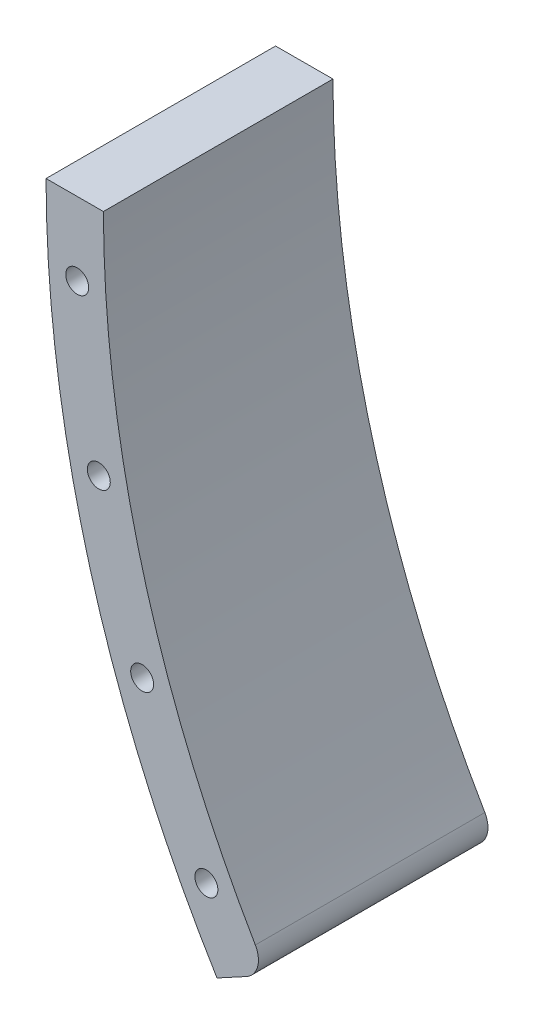
ISO-10303-21;
HEADER;
FILE_DESCRIPTION(('STEP AP214'),'2;1');
FILE_NAME('part.step','',(''),(''),'','','');
FILE_SCHEMA(('AUTOMOTIVE_DESIGN { 1 0 10303 214 1 1 1 1 }'));
ENDSEC;
DATA;
#1=APPLICATION_CONTEXT('core data for automotive mechanical design processes');
#2=APPLICATION_PROTOCOL_DEFINITION('international standard','automotive_design',2000,#1);
#3=PRODUCT_CONTEXT('',#1,'mechanical');
#4=PRODUCT('Part','Part','',(#3));
#5=PRODUCT_RELATED_PRODUCT_CATEGORY('part','',(#4));
#6=PRODUCT_DEFINITION_FORMATION('','',#4);
#7=PRODUCT_DEFINITION_CONTEXT('part definition',#1,'design');
#8=PRODUCT_DEFINITION('design','',#6,#7);
#9=PRODUCT_DEFINITION_SHAPE('','',#8);
#10=(LENGTH_UNIT() NAMED_UNIT(*) SI_UNIT(.MILLI.,.METRE.));
#11=(NAMED_UNIT(*) PLANE_ANGLE_UNIT() SI_UNIT($,.RADIAN.));
#12=(NAMED_UNIT(*) SI_UNIT($,.STERADIAN.) SOLID_ANGLE_UNIT());
#13=UNCERTAINTY_MEASURE_WITH_UNIT(LENGTH_MEASURE(1.E-05),#10,'distance_accuracy_value','');
#14=(GEOMETRIC_REPRESENTATION_CONTEXT(3) GLOBAL_UNCERTAINTY_ASSIGNED_CONTEXT((#13)) GLOBAL_UNIT_ASSIGNED_CONTEXT((#10,
#11,#12)) REPRESENTATION_CONTEXT('',''));
#15=CARTESIAN_POINT('',(0.,0.,0.));
#16=DIRECTION('',(0.,0.,1.));
#17=DIRECTION('',(1.,0.,0.));
#18=AXIS2_PLACEMENT_3D('',#15,#16,#17);
#19=CARTESIAN_POINT('',(70.,-12.3683000000003,40.));
#20=DIRECTION('',(0.,0.,1.));
#21=DIRECTION('',(1.,0.,0.));
#22=AXIS2_PLACEMENT_3D('',#19,#20,#21);
#23=PLANE('',#22);
#24=CARTESIAN_POINT('',(-117.250891281488,-79.7337489652391,40.));
#25=DIRECTION('',(0.,0.,1.));
#26=DIRECTION('',(1.,0.,0.));
#27=AXIS2_PLACEMENT_3D('',#24,#25,#26);
#28=CIRCLE('',#27,2.);
#29=CARTESIAN_POINT('',(-115.250891281488,-79.7337489652391,40.));
#30=VERTEX_POINT('',#29);
#31=EDGE_CURVE('E128',#30,#30,#28,.T.);
#32=ORIENTED_EDGE('',*,*,#31,.F.);
#33=EDGE_LOOP('',(#32));
#34=FACE_BOUND('',#33,.T.);
#35=CARTESIAN_POINT('',(-128.565543545409,-25.5107851727687,40.));
#36=DIRECTION('',(0.,0.,1.));
#37=DIRECTION('',(1.,0.,0.));
#38=AXIS2_PLACEMENT_3D('',#35,#36,#37);
#39=CIRCLE('',#38,2.);
#40=CARTESIAN_POINT('',(-126.565543545409,-25.5107851727687,40.));
#41=VERTEX_POINT('',#40);
#42=EDGE_CURVE('E116',#41,#41,#39,.T.);
#43=ORIENTED_EDGE('',*,*,#42,.F.);
#44=EDGE_LOOP('',(#43));
#45=FACE_BOUND('',#44,.T.);
#46=DIRECTION('',(0.878737629728585,0.477305120545536,0.));
#47=VECTOR('',#46,1.);
#48=CARTESIAN_POINT('',(-95.4065456337183,-113.742234823113,40.));
#49=LINE('',#48,#47);
#50=CARTESIAN_POINT('',(-104.20534041752,-118.52148822351,40.));
#51=VERTEX_POINT('',#50);
#52=CARTESIAN_POINT('',(-99.0706876937644,-115.732491878801,40.));
#53=VERTEX_POINT('',#52);
#54=EDGE_CURVE('E76',#51,#53,#49,.T.);
#55=ORIENTED_EDGE('',*,*,#54,.T.);
#56=CARTESIAN_POINT('',(-100.979908175947,-112.217541359887,40.));
#57=DIRECTION('',(0.,0.,1.));
#58=DIRECTION('',(1.,0.,0.));
#59=AXIS2_PLACEMENT_3D('',#56,#57,#58);
#60=CIRCLE('',#59,4.);
#61=CARTESIAN_POINT('',(-97.5257686168365,-110.200384968778,40.));
#62=VERTEX_POINT('',#61);
#63=EDGE_CURVE('E11',#53,#62,#60,.T.);
#64=ORIENTED_EDGE('',*,*,#63,.T.);
#65=CARTESIAN_POINT('',(70.,-12.3683000000003,40.));
#66=DIRECTION('',(0.,0.,-1.));
#67=DIRECTION('',(1.,0.,0.));
#68=AXIS2_PLACEMENT_3D('',#65,#66,#67);
#69=CIRCLE('',#68,194.);
#70=CARTESIAN_POINT('',(-123.999650399453,-12.7365999999998,40.));
#71=VERTEX_POINT('',#70);
#72=EDGE_CURVE('E84',#62,#71,#69,.T.);
#73=ORIENTED_EDGE('',*,*,#72,.T.);
#74=DIRECTION('',(-0.999998197935325,-0.00189845360826553,0.));
#75=VECTOR('',#74,1.);
#76=CARTESIAN_POINT('',(-123.999650399453,-12.7365999999999,40.));
#77=LINE('',#76,#75);
#78=CARTESIAN_POINT('',(-133.999632378806,-12.7555845360825,40.));
#79=VERTEX_POINT('',#78);
#80=EDGE_CURVE('E90',#71,#79,#77,.T.);
#81=ORIENTED_EDGE('',*,*,#80,.T.);
#82=CARTESIAN_POINT('',(70.,-12.3683000000003,40.));
#83=DIRECTION('',(0.,0.,1.));
#84=DIRECTION('',(1.,0.,0.));
#85=AXIS2_PLACEMENT_3D('',#82,#83,#84);
#86=CIRCLE('',#85,204.);
#87=EDGE_CURVE('E85',#79,#51,#86,.T.);
#88=ORIENTED_EDGE('',*,*,#87,.T.);
#89=EDGE_LOOP('',(#55,#64,#73,#81,#88));
#90=FACE_BOUND('',#89,.T.);
#91=CARTESIAN_POINT('',(-124.804036909517,-53.0178658495351,40.));
#92=DIRECTION('',(0.,0.,1.));
#93=DIRECTION('',(1.,0.,0.));
#94=AXIS2_PLACEMENT_3D('',#91,#92,#93);
#95=CIRCLE('',#94,2.);
#96=CARTESIAN_POINT('',(-122.804036909517,-53.0178658495351,40.));
#97=VERTEX_POINT('',#96);
#98=EDGE_CURVE('E122',#97,#97,#95,.T.);
#99=ORIENTED_EDGE('',*,*,#98,.F.);
#100=EDGE_LOOP('',(#99));
#101=FACE_BOUND('',#100,.T.);
#102=CARTESIAN_POINT('',(-106.053120049398,-105.138440243897,40.));
#103=DIRECTION('',(0.,0.,1.));
#104=DIRECTION('',(1.,0.,0.));
#105=AXIS2_PLACEMENT_3D('',#102,#103,#104);
#106=CIRCLE('',#105,2.);
#107=CARTESIAN_POINT('',(-104.053120049398,-105.138440243897,40.));
#108=VERTEX_POINT('',#107);
#109=EDGE_CURVE('E134',#108,#108,#106,.T.);
#110=ORIENTED_EDGE('',*,*,#109,.F.);
#111=EDGE_LOOP('',(#110));
#112=FACE_BOUND('',#111,.T.);
#113=ADVANCED_FACE('F33',(#34,#45,#90,#101,#112),#23,.T.);
#114=CARTESIAN_POINT('',(70.,-12.3683000000003,0.));
#115=DIRECTION('',(0.,0.,1.));
#116=DIRECTION('',(1.,0.,0.));
#117=AXIS2_PLACEMENT_3D('',#114,#115,#116);
#118=PLANE('',#117);
#119=CARTESIAN_POINT('',(70.,-12.3683000000003,0.));
#120=DIRECTION('',(0.,0.,-1.));
#121=DIRECTION('',(1.,0.,0.));
#122=AXIS2_PLACEMENT_3D('',#119,#120,#121);
#123=CIRCLE('',#122,194.);
#124=CARTESIAN_POINT('',(-97.5257686168365,-110.200384968778,0.));
#125=VERTEX_POINT('',#124);
#126=CARTESIAN_POINT('',(-123.999650399453,-12.7365999999998,0.));
#127=VERTEX_POINT('',#126);
#128=EDGE_CURVE('E111',#125,#127,#123,.T.);
#129=ORIENTED_EDGE('',*,*,#128,.F.);
#130=CARTESIAN_POINT('',(-100.979908175947,-112.217541359887,0.));
#131=DIRECTION('',(0.,0.,1.));
#132=DIRECTION('',(1.,0.,0.));
#133=AXIS2_PLACEMENT_3D('',#130,#131,#132);
#134=CIRCLE('',#133,4.);
#135=CARTESIAN_POINT('',(-99.0706876937644,-115.732491878801,0.));
#136=VERTEX_POINT('',#135);
#137=EDGE_CURVE('E55',#125,#136,#134,.F.);
#138=ORIENTED_EDGE('',*,*,#137,.T.);
#139=DIRECTION('',(0.878737629728585,0.477305120545536,0.));
#140=VECTOR('',#139,1.);
#141=CARTESIAN_POINT('',(-95.4065456337183,-113.742234823113,0.));
#142=LINE('',#141,#140);
#143=CARTESIAN_POINT('',(-104.20534041752,-118.52148822351,0.));
#144=VERTEX_POINT('',#143);
#145=EDGE_CURVE('E113',#144,#136,#142,.T.);
#146=ORIENTED_EDGE('',*,*,#145,.F.);
#147=CARTESIAN_POINT('',(70.,-12.3683000000003,0.));
#148=DIRECTION('',(0.,0.,1.));
#149=DIRECTION('',(1.,0.,0.));
#150=AXIS2_PLACEMENT_3D('',#147,#148,#149);
#151=CIRCLE('',#150,204.);
#152=CARTESIAN_POINT('',(-133.999632378806,-12.7555845360825,0.));
#153=VERTEX_POINT('',#152);
#154=EDGE_CURVE('E98',#153,#144,#151,.T.);
#155=ORIENTED_EDGE('',*,*,#154,.F.);
#156=DIRECTION('',(-0.999998197935325,-0.00189845360826553,0.));
#157=VECTOR('',#156,1.);
#158=CARTESIAN_POINT('',(-123.999650399453,-12.7365999999999,0.));
#159=LINE('',#158,#157);
#160=EDGE_CURVE('E94',#127,#153,#159,.T.);
#161=ORIENTED_EDGE('',*,*,#160,.F.);
#162=EDGE_LOOP('',(#129,#138,#146,#155,#161));
#163=FACE_BOUND('',#162,.T.);
#164=CARTESIAN_POINT('',(-128.565543545409,-25.5107851727687,0.));
#165=DIRECTION('',(0.,0.,1.));
#166=DIRECTION('',(1.,0.,0.));
#167=AXIS2_PLACEMENT_3D('',#164,#165,#166);
#168=CIRCLE('',#167,2.);
#169=CARTESIAN_POINT('',(-126.565543545409,-25.5107851727687,0.));
#170=VERTEX_POINT('',#169);
#171=EDGE_CURVE('E119',#170,#170,#168,.T.);
#172=ORIENTED_EDGE('',*,*,#171,.T.);
#173=EDGE_LOOP('',(#172));
#174=FACE_BOUND('',#173,.T.);
#175=CARTESIAN_POINT('',(-124.804036909517,-53.0178658495351,0.));
#176=DIRECTION('',(0.,0.,1.));
#177=DIRECTION('',(1.,0.,0.));
#178=AXIS2_PLACEMENT_3D('',#175,#176,#177);
#179=CIRCLE('',#178,2.);
#180=CARTESIAN_POINT('',(-122.804036909517,-53.0178658495351,0.));
#181=VERTEX_POINT('',#180);
#182=EDGE_CURVE('E125',#181,#181,#179,.T.);
#183=ORIENTED_EDGE('',*,*,#182,.T.);
#184=EDGE_LOOP('',(#183));
#185=FACE_BOUND('',#184,.T.);
#186=CARTESIAN_POINT('',(-117.250891281488,-79.7337489652391,0.));
#187=DIRECTION('',(0.,0.,1.));
#188=DIRECTION('',(1.,0.,0.));
#189=AXIS2_PLACEMENT_3D('',#186,#187,#188);
#190=CIRCLE('',#189,2.);
#191=CARTESIAN_POINT('',(-115.250891281488,-79.7337489652391,0.));
#192=VERTEX_POINT('',#191);
#193=EDGE_CURVE('E131',#192,#192,#190,.T.);
#194=ORIENTED_EDGE('',*,*,#193,.T.);
#195=EDGE_LOOP('',(#194));
#196=FACE_BOUND('',#195,.T.);
#197=CARTESIAN_POINT('',(-106.053120049398,-105.138440243897,0.));
#198=DIRECTION('',(0.,0.,1.));
#199=DIRECTION('',(1.,0.,0.));
#200=AXIS2_PLACEMENT_3D('',#197,#198,#199);
#201=CIRCLE('',#200,2.);
#202=CARTESIAN_POINT('',(-104.053120049398,-105.138440243897,0.));
#203=VERTEX_POINT('',#202);
#204=EDGE_CURVE('E137',#203,#203,#201,.T.);
#205=ORIENTED_EDGE('',*,*,#204,.T.);
#206=EDGE_LOOP('',(#205));
#207=FACE_BOUND('',#206,.T.);
#208=ADVANCED_FACE('F147',(#163,#174,#185,#196,#207),#118,.F.);
#209=CARTESIAN_POINT('',(70.,-12.3683000000003,40.));
#210=DIRECTION('',(0.,0.,-1.));
#211=DIRECTION('',(-1.,0.,0.));
#212=AXIS2_PLACEMENT_3D('',#209,#210,#211);
#213=CYLINDRICAL_SURFACE('',#212,204.);
#214=ORIENTED_EDGE('',*,*,#154,.T.);
#215=DIRECTION('',(0.,0.,-1.));
#216=VECTOR('',#215,1.);
#217=CARTESIAN_POINT('',(-104.20534041752,-118.52148822351,40.));
#218=LINE('',#217,#216);
#219=EDGE_CURVE('E80',#51,#144,#218,.T.);
#220=ORIENTED_EDGE('',*,*,#219,.F.);
#221=ORIENTED_EDGE('',*,*,#87,.F.);
#222=DIRECTION('',(0.,0.,-1.));
#223=VECTOR('',#222,1.);
#224=CARTESIAN_POINT('',(-133.999632378806,-12.7555845360825,40.));
#225=LINE('',#224,#223);
#226=EDGE_CURVE('E105',#79,#153,#225,.T.);
#227=ORIENTED_EDGE('',*,*,#226,.T.);
#228=EDGE_LOOP('',(#214,#220,#221,#227));
#229=FACE_BOUND('',#228,.T.);
#230=ADVANCED_FACE('F96',(#229),#213,.T.);
#231=CARTESIAN_POINT('',(-95.4065456337183,-113.742234823113,40.));
#232=DIRECTION('',(-0.477305120545536,0.878737629728585,0.));
#233=DIRECTION('',(-0.878737629728585,-0.477305120545536,0.));
#234=AXIS2_PLACEMENT_3D('',#231,#232,#233);
#235=PLANE('',#234);
#236=ORIENTED_EDGE('',*,*,#145,.T.);
#237=DIRECTION('',(0.,0.,-1.));
#238=VECTOR('',#237,1.);
#239=CARTESIAN_POINT('',(-99.0706876937644,-115.732491878801,40.));
#240=LINE('',#239,#238);
#241=EDGE_CURVE('E41',#136,#53,#240,.F.);
#242=ORIENTED_EDGE('',*,*,#241,.T.);
#243=ORIENTED_EDGE('',*,*,#54,.F.);
#244=ORIENTED_EDGE('',*,*,#219,.T.);
#245=EDGE_LOOP('',(#236,#242,#243,#244));
#246=FACE_BOUND('',#245,.T.);
#247=ADVANCED_FACE('F78',(#246),#235,.F.);
#248=CARTESIAN_POINT('',(70.,-12.3683000000003,40.));
#249=DIRECTION('',(0.,0.,-1.));
#250=DIRECTION('',(-1.,0.,0.));
#251=AXIS2_PLACEMENT_3D('',#248,#249,#250);
#252=CYLINDRICAL_SURFACE('',#251,194.);
#253=ORIENTED_EDGE('',*,*,#72,.F.);
#254=DIRECTION('',(0.,0.,-1.));
#255=VECTOR('',#254,1.);
#256=CARTESIAN_POINT('',(-97.5257686168365,-110.200384968778,40.));
#257=LINE('',#256,#255);
#258=EDGE_CURVE('E99',#62,#125,#257,.T.);
#259=ORIENTED_EDGE('',*,*,#258,.T.);
#260=ORIENTED_EDGE('',*,*,#128,.T.);
#261=DIRECTION('',(0.,0.,-1.));
#262=VECTOR('',#261,1.);
#263=CARTESIAN_POINT('',(-123.999650399453,-12.7365999999998,40.));
#264=LINE('',#263,#262);
#265=EDGE_CURVE('E100',#71,#127,#264,.T.);
#266=ORIENTED_EDGE('',*,*,#265,.F.);
#267=EDGE_LOOP('',(#253,#259,#260,#266));
#268=FACE_BOUND('',#267,.T.);
#269=ADVANCED_FACE('F163',(#268),#252,.F.);
#270=CARTESIAN_POINT('',(-123.999650399453,-12.7365999999999,40.));
#271=DIRECTION('',(0.00189845360826553,-0.999998197935325,0.));
#272=DIRECTION('',(0.999998197935325,0.00189845360826553,0.));
#273=AXIS2_PLACEMENT_3D('',#270,#271,#272);
#274=PLANE('',#273);
#275=ORIENTED_EDGE('',*,*,#160,.T.);
#276=ORIENTED_EDGE('',*,*,#226,.F.);
#277=ORIENTED_EDGE('',*,*,#80,.F.);
#278=ORIENTED_EDGE('',*,*,#265,.T.);
#279=EDGE_LOOP('',(#275,#276,#277,#278));
#280=FACE_BOUND('',#279,.T.);
#281=ADVANCED_FACE('F160',(#280),#274,.F.);
#282=CARTESIAN_POINT('',(-128.565543545409,-25.5107851727687,40.));
#283=DIRECTION('',(0.,0.,-1.));
#284=DIRECTION('',(-1.,0.,0.));
#285=AXIS2_PLACEMENT_3D('',#282,#283,#284);
#286=CYLINDRICAL_SURFACE('',#285,2.);
#287=ORIENTED_EDGE('',*,*,#42,.T.);
#288=EDGE_LOOP('',(#287));
#289=FACE_BOUND('',#288,.T.);
#290=ORIENTED_EDGE('',*,*,#171,.F.);
#291=EDGE_LOOP('',(#290));
#292=FACE_BOUND('',#291,.T.);
#293=ADVANCED_FACE('F157',(#289,#292),#286,.F.);
#294=CARTESIAN_POINT('',(-124.804036909517,-53.0178658495351,40.));
#295=DIRECTION('',(0.,0.,-1.));
#296=DIRECTION('',(-1.,0.,0.));
#297=AXIS2_PLACEMENT_3D('',#294,#295,#296);
#298=CYLINDRICAL_SURFACE('',#297,2.);
#299=ORIENTED_EDGE('',*,*,#98,.T.);
#300=EDGE_LOOP('',(#299));
#301=FACE_BOUND('',#300,.T.);
#302=ORIENTED_EDGE('',*,*,#182,.F.);
#303=EDGE_LOOP('',(#302));
#304=FACE_BOUND('',#303,.T.);
#305=ADVANCED_FACE('F193',(#301,#304),#298,.F.);
#306=CARTESIAN_POINT('',(-117.250891281488,-79.7337489652391,40.));
#307=DIRECTION('',(0.,0.,-1.));
#308=DIRECTION('',(-1.,0.,0.));
#309=AXIS2_PLACEMENT_3D('',#306,#307,#308);
#310=CYLINDRICAL_SURFACE('',#309,2.);
#311=ORIENTED_EDGE('',*,*,#31,.T.);
#312=EDGE_LOOP('',(#311));
#313=FACE_BOUND('',#312,.T.);
#314=ORIENTED_EDGE('',*,*,#193,.F.);
#315=EDGE_LOOP('',(#314));
#316=FACE_BOUND('',#315,.T.);
#317=ADVANCED_FACE('F200',(#313,#316),#310,.F.);
#318=CARTESIAN_POINT('',(-106.053120049398,-105.138440243897,40.));
#319=DIRECTION('',(0.,0.,-1.));
#320=DIRECTION('',(-1.,0.,0.));
#321=AXIS2_PLACEMENT_3D('',#318,#319,#320);
#322=CYLINDRICAL_SURFACE('',#321,2.);
#323=ORIENTED_EDGE('',*,*,#109,.T.);
#324=EDGE_LOOP('',(#323));
#325=FACE_BOUND('',#324,.T.);
#326=ORIENTED_EDGE('',*,*,#204,.F.);
#327=EDGE_LOOP('',(#326));
#328=FACE_BOUND('',#327,.T.);
#329=ADVANCED_FACE('F143',(#325,#328),#322,.F.);
#330=CARTESIAN_POINT('',(-100.979908175947,-112.217541359887,40.));
#331=DIRECTION('',(0.,0.,-1.));
#332=DIRECTION('',(-1.,0.,0.));
#333=AXIS2_PLACEMENT_3D('',#330,#331,#332);
#334=CYLINDRICAL_SURFACE('',#333,4.);
#335=ORIENTED_EDGE('',*,*,#63,.F.);
#336=ORIENTED_EDGE('',*,*,#241,.F.);
#337=ORIENTED_EDGE('',*,*,#137,.F.);
#338=ORIENTED_EDGE('',*,*,#258,.F.);
#339=EDGE_LOOP('',(#335,#336,#337,#338));
#340=FACE_BOUND('',#339,.T.);
#341=ADVANCED_FACE('F35',(#340),#334,.T.);
#342=CLOSED_SHELL('',(#113,#208,#230,#247,#269,#281,#293,#305,#317,#329,#341));
#343=MANIFOLD_SOLID_BREP('B2',#342);
#344=ADVANCED_BREP_SHAPE_REPRESENTATION('',(#18,#343),#14);
#345=SHAPE_DEFINITION_REPRESENTATION(#9,#344);
ENDSEC;
END-ISO-10303-21;
